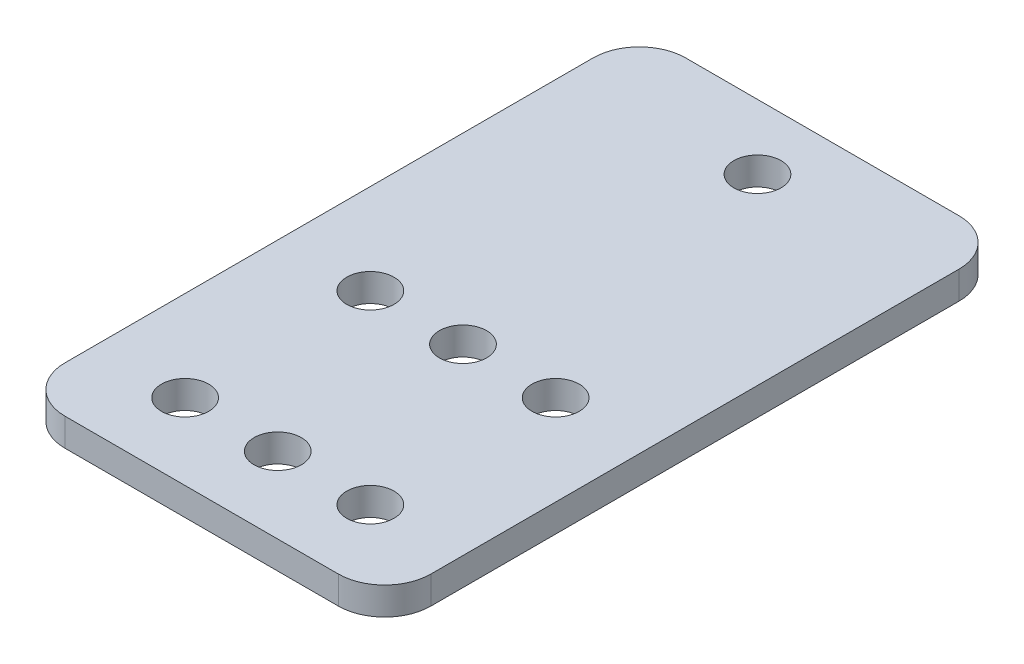
ISO-10303-21;
HEADER;
FILE_DESCRIPTION(('STEP AP214'),'2;1');
FILE_NAME('part.step','',(''),(''),'','','');
FILE_SCHEMA(('AUTOMOTIVE_DESIGN { 1 0 10303 214 1 1 1 1 }'));
ENDSEC;
DATA;
#1=APPLICATION_CONTEXT('core data for automotive mechanical design processes');
#2=APPLICATION_PROTOCOL_DEFINITION('international standard','automotive_design',2000,#1);
#3=PRODUCT_CONTEXT('',#1,'mechanical');
#4=PRODUCT('Part','Part','',(#3));
#5=PRODUCT_RELATED_PRODUCT_CATEGORY('part','',(#4));
#6=PRODUCT_DEFINITION_FORMATION('','',#4);
#7=PRODUCT_DEFINITION_CONTEXT('part definition',#1,'design');
#8=PRODUCT_DEFINITION('design','',#6,#7);
#9=PRODUCT_DEFINITION_SHAPE('','',#8);
#10=(LENGTH_UNIT() NAMED_UNIT(*) SI_UNIT(.MILLI.,.METRE.));
#11=(NAMED_UNIT(*) PLANE_ANGLE_UNIT() SI_UNIT($,.RADIAN.));
#12=(NAMED_UNIT(*) SI_UNIT($,.STERADIAN.) SOLID_ANGLE_UNIT());
#13=UNCERTAINTY_MEASURE_WITH_UNIT(LENGTH_MEASURE(1.E-05),#10,'distance_accuracy_value','');
#14=(GEOMETRIC_REPRESENTATION_CONTEXT(3) GLOBAL_UNCERTAINTY_ASSIGNED_CONTEXT((#13)) GLOBAL_UNIT_ASSIGNED_CONTEXT((#10,
#11,#12)) REPRESENTATION_CONTEXT('',''));
#15=CARTESIAN_POINT('',(0.,0.,0.));
#16=DIRECTION('',(0.,0.,1.));
#17=DIRECTION('',(1.,0.,0.));
#18=AXIS2_PLACEMENT_3D('',#15,#16,#17);
#19=CARTESIAN_POINT('',(19.75,3.,33.5));
#20=DIRECTION('',(-1.,0.,0.));
#21=DIRECTION('',(0.,0.,1.));
#22=AXIS2_PLACEMENT_3D('',#19,#20,#21);
#23=PLANE('',#22);
#24=DIRECTION('',(0.,0.,-1.));
#25=VECTOR('',#24,1.);
#26=CARTESIAN_POINT('',(19.75,3.,33.5));
#27=LINE('',#26,#25);
#28=CARTESIAN_POINT('',(19.75,3.,28.5));
#29=VERTEX_POINT('',#28);
#30=CARTESIAN_POINT('',(19.75,3.,-28.5));
#31=VERTEX_POINT('',#30);
#32=EDGE_CURVE('E123',#29,#31,#27,.T.);
#33=ORIENTED_EDGE('',*,*,#32,.F.);
#34=DIRECTION('',(0.,-1.,0.));
#35=VECTOR('',#34,1.);
#36=CARTESIAN_POINT('',(19.75,3.,28.5));
#37=LINE('',#36,#35);
#38=CARTESIAN_POINT('',(19.75,0.,28.5));
#39=VERTEX_POINT('',#38);
#40=EDGE_CURVE('E149',#29,#39,#37,.T.);
#41=ORIENTED_EDGE('',*,*,#40,.T.);
#42=DIRECTION('',(0.,0.,-1.));
#43=VECTOR('',#42,1.);
#44=CARTESIAN_POINT('',(19.75,0.,33.5));
#45=LINE('',#44,#43);
#46=CARTESIAN_POINT('',(19.75,0.,-28.5));
#47=VERTEX_POINT('',#46);
#48=EDGE_CURVE('E157',#39,#47,#45,.T.);
#49=ORIENTED_EDGE('',*,*,#48,.T.);
#50=DIRECTION('',(0.,-1.,0.));
#51=VECTOR('',#50,1.);
#52=CARTESIAN_POINT('',(19.75,3.,-28.5));
#53=LINE('',#52,#51);
#54=EDGE_CURVE('E147',#47,#31,#53,.F.);
#55=ORIENTED_EDGE('',*,*,#54,.T.);
#56=EDGE_LOOP('',(#33,#41,#49,#55));
#57=FACE_BOUND('',#56,.T.);
#58=ADVANCED_FACE('F32',(#57),#23,.F.);
#59=CARTESIAN_POINT('',(-19.75,3.,-33.5));
#60=DIRECTION('',(0.,0.,1.));
#61=DIRECTION('',(1.,0.,0.));
#62=AXIS2_PLACEMENT_3D('',#59,#60,#61);
#63=PLANE('',#62);
#64=DIRECTION('',(-1.,0.,0.));
#65=VECTOR('',#64,1.);
#66=CARTESIAN_POINT('',(-19.75,0.,-33.5));
#67=LINE('',#66,#65);
#68=CARTESIAN_POINT('',(14.75,0.,-33.5));
#69=VERTEX_POINT('',#68);
#70=CARTESIAN_POINT('',(-14.75,0.,-33.5));
#71=VERTEX_POINT('',#70);
#72=EDGE_CURVE('E128',#69,#71,#67,.T.);
#73=ORIENTED_EDGE('',*,*,#72,.T.);
#74=DIRECTION('',(0.,-1.,0.));
#75=VECTOR('',#74,1.);
#76=CARTESIAN_POINT('',(-14.75,3.,-33.5));
#77=LINE('',#76,#75);
#78=CARTESIAN_POINT('',(-14.75,3.,-33.5));
#79=VERTEX_POINT('',#78);
#80=EDGE_CURVE('E11',#71,#79,#77,.F.);
#81=ORIENTED_EDGE('',*,*,#80,.T.);
#82=DIRECTION('',(-1.,0.,0.));
#83=VECTOR('',#82,1.);
#84=CARTESIAN_POINT('',(-19.75,3.,-33.5));
#85=LINE('',#84,#83);
#86=CARTESIAN_POINT('',(14.75,3.,-33.5));
#87=VERTEX_POINT('',#86);
#88=EDGE_CURVE('E126',#87,#79,#85,.T.);
#89=ORIENTED_EDGE('',*,*,#88,.F.);
#90=DIRECTION('',(0.,-1.,0.));
#91=VECTOR('',#90,1.);
#92=CARTESIAN_POINT('',(14.75,3.,-33.5));
#93=LINE('',#92,#91);
#94=EDGE_CURVE('E40',#87,#69,#93,.T.);
#95=ORIENTED_EDGE('',*,*,#94,.T.);
#96=EDGE_LOOP('',(#73,#81,#89,#95));
#97=FACE_BOUND('',#96,.T.);
#98=ADVANCED_FACE('F154',(#97),#63,.F.);
#99=CARTESIAN_POINT('',(-19.75,3.,33.5));
#100=DIRECTION('',(1.,0.,0.));
#101=DIRECTION('',(0.,0.,-1.));
#102=AXIS2_PLACEMENT_3D('',#99,#100,#101);
#103=PLANE('',#102);
#104=DIRECTION('',(0.,0.,1.));
#105=VECTOR('',#104,1.);
#106=CARTESIAN_POINT('',(-19.75,0.,33.5));
#107=LINE('',#106,#105);
#108=CARTESIAN_POINT('',(-19.75,0.,-28.5));
#109=VERTEX_POINT('',#108);
#110=CARTESIAN_POINT('',(-19.75,0.,28.5));
#111=VERTEX_POINT('',#110);
#112=EDGE_CURVE('E124',#109,#111,#107,.T.);
#113=ORIENTED_EDGE('',*,*,#112,.T.);
#114=DIRECTION('',(0.,-1.,0.));
#115=VECTOR('',#114,1.);
#116=CARTESIAN_POINT('',(-19.75,3.,28.5));
#117=LINE('',#116,#115);
#118=CARTESIAN_POINT('',(-19.75,3.,28.5));
#119=VERTEX_POINT('',#118);
#120=EDGE_CURVE('E102',#111,#119,#117,.F.);
#121=ORIENTED_EDGE('',*,*,#120,.T.);
#122=DIRECTION('',(0.,0.,1.));
#123=VECTOR('',#122,1.);
#124=CARTESIAN_POINT('',(-19.75,3.,33.5));
#125=LINE('',#124,#123);
#126=CARTESIAN_POINT('',(-19.75,3.,-28.5));
#127=VERTEX_POINT('',#126);
#128=EDGE_CURVE('E162',#127,#119,#125,.T.);
#129=ORIENTED_EDGE('',*,*,#128,.F.);
#130=DIRECTION('',(0.,-1.,0.));
#131=VECTOR('',#130,1.);
#132=CARTESIAN_POINT('',(-19.75,3.,-28.5));
#133=LINE('',#132,#131);
#134=EDGE_CURVE('E107',#127,#109,#133,.T.);
#135=ORIENTED_EDGE('',*,*,#134,.T.);
#136=EDGE_LOOP('',(#113,#121,#129,#135));
#137=FACE_BOUND('',#136,.T.);
#138=ADVANCED_FACE('F230',(#137),#103,.F.);
#139=CARTESIAN_POINT('',(-19.75,3.,33.5));
#140=DIRECTION('',(0.,0.,-1.));
#141=DIRECTION('',(-1.,0.,0.));
#142=AXIS2_PLACEMENT_3D('',#139,#140,#141);
#143=PLANE('',#142);
#144=DIRECTION('',(1.,0.,0.));
#145=VECTOR('',#144,1.);
#146=CARTESIAN_POINT('',(-19.75,3.,33.5));
#147=LINE('',#146,#145);
#148=CARTESIAN_POINT('',(-14.75,3.,33.5));
#149=VERTEX_POINT('',#148);
#150=CARTESIAN_POINT('',(14.75,3.,33.5));
#151=VERTEX_POINT('',#150);
#152=EDGE_CURVE('E117',#149,#151,#147,.T.);
#153=ORIENTED_EDGE('',*,*,#152,.F.);
#154=DIRECTION('',(0.,-1.,0.));
#155=VECTOR('',#154,1.);
#156=CARTESIAN_POINT('',(-14.75,3.,33.5));
#157=LINE('',#156,#155);
#158=CARTESIAN_POINT('',(-14.75,0.,33.5));
#159=VERTEX_POINT('',#158);
#160=EDGE_CURVE('E101',#149,#159,#157,.T.);
#161=ORIENTED_EDGE('',*,*,#160,.T.);
#162=DIRECTION('',(1.,0.,0.));
#163=VECTOR('',#162,1.);
#164=CARTESIAN_POINT('',(-19.75,0.,33.5));
#165=LINE('',#164,#163);
#166=CARTESIAN_POINT('',(14.75,0.,33.5));
#167=VERTEX_POINT('',#166);
#168=EDGE_CURVE('E114',#159,#167,#165,.T.);
#169=ORIENTED_EDGE('',*,*,#168,.T.);
#170=DIRECTION('',(0.,-1.,0.));
#171=VECTOR('',#170,1.);
#172=CARTESIAN_POINT('',(14.75,3.,33.5));
#173=LINE('',#172,#171);
#174=EDGE_CURVE('E119',#167,#151,#173,.F.);
#175=ORIENTED_EDGE('',*,*,#174,.T.);
#176=EDGE_LOOP('',(#153,#161,#169,#175));
#177=FACE_BOUND('',#176,.T.);
#178=ADVANCED_FACE('F113',(#177),#143,.F.);
#179=CARTESIAN_POINT('',(0.,3.,0.));
#180=DIRECTION('',(0.,-1.,0.));
#181=DIRECTION('',(0.,0.,-1.));
#182=AXIS2_PLACEMENT_3D('',#179,#180,#181);
#183=PLANE('',#182);
#184=CARTESIAN_POINT('',(10.,3.,5.29));
#185=DIRECTION('',(0.,1.,0.));
#186=DIRECTION('',(0.,0.,-1.));
#187=AXIS2_PLACEMENT_3D('',#184,#185,#186);
#188=CIRCLE('',#187,2.55);
#189=CARTESIAN_POINT('',(10.,3.,2.74));
#190=VERTEX_POINT('',#189);
#191=EDGE_CURVE('E172',#190,#190,#188,.T.);
#192=ORIENTED_EDGE('',*,*,#191,.F.);
#193=EDGE_LOOP('',(#192));
#194=FACE_BOUND('',#193,.T.);
#195=CARTESIAN_POINT('',(10.,3.,25.29));
#196=DIRECTION('',(0.,1.,0.));
#197=DIRECTION('',(0.,0.,-1.));
#198=AXIS2_PLACEMENT_3D('',#195,#196,#197);
#199=CIRCLE('',#198,2.55);
#200=CARTESIAN_POINT('',(10.,3.,22.74));
#201=VERTEX_POINT('',#200);
#202=EDGE_CURVE('E178',#201,#201,#199,.T.);
#203=ORIENTED_EDGE('',*,*,#202,.F.);
#204=EDGE_LOOP('',(#203));
#205=FACE_BOUND('',#204,.T.);
#206=CARTESIAN_POINT('',(0.,3.,25.29));
#207=DIRECTION('',(0.,1.,0.));
#208=DIRECTION('',(0.,0.,1.));
#209=AXIS2_PLACEMENT_3D('',#206,#207,#208);
#210=CIRCLE('',#209,2.55);
#211=CARTESIAN_POINT('',(0.,3.,27.84));
#212=VERTEX_POINT('',#211);
#213=EDGE_CURVE('E192',#212,#212,#210,.T.);
#214=ORIENTED_EDGE('',*,*,#213,.F.);
#215=EDGE_LOOP('',(#214));
#216=FACE_BOUND('',#215,.T.);
#217=CARTESIAN_POINT('',(-10.,3.,5.29));
#218=DIRECTION('',(0.,1.,0.));
#219=DIRECTION('',(0.,0.,1.));
#220=AXIS2_PLACEMENT_3D('',#217,#218,#219);
#221=CIRCLE('',#220,2.55);
#222=CARTESIAN_POINT('',(-10.,3.,7.84));
#223=VERTEX_POINT('',#222);
#224=EDGE_CURVE('E185',#223,#223,#221,.T.);
#225=ORIENTED_EDGE('',*,*,#224,.F.);
#226=EDGE_LOOP('',(#225));
#227=FACE_BOUND('',#226,.T.);
#228=CARTESIAN_POINT('',(-10.,3.,25.29));
#229=DIRECTION('',(0.,1.,0.));
#230=DIRECTION('',(0.,0.,1.));
#231=AXIS2_PLACEMENT_3D('',#228,#229,#230);
#232=CIRCLE('',#231,2.55);
#233=CARTESIAN_POINT('',(-10.,3.,27.84));
#234=VERTEX_POINT('',#233);
#235=EDGE_CURVE('E202',#234,#234,#232,.T.);
#236=ORIENTED_EDGE('',*,*,#235,.F.);
#237=EDGE_LOOP('',(#236));
#238=FACE_BOUND('',#237,.T.);
#239=CARTESIAN_POINT('',(0.,3.,-26.5));
#240=DIRECTION('',(0.,1.,0.));
#241=DIRECTION('',(0.,0.,1.));
#242=AXIS2_PLACEMENT_3D('',#239,#240,#241);
#243=CIRCLE('',#242,2.55);
#244=CARTESIAN_POINT('',(0.,3.,-23.95));
#245=VERTEX_POINT('',#244);
#246=EDGE_CURVE('E184',#245,#245,#243,.T.);
#247=ORIENTED_EDGE('',*,*,#246,.F.);
#248=EDGE_LOOP('',(#247));
#249=FACE_BOUND('',#248,.T.);
#250=CARTESIAN_POINT('',(0.,3.,5.29));
#251=DIRECTION('',(0.,1.,0.));
#252=DIRECTION('',(0.,0.,1.));
#253=AXIS2_PLACEMENT_3D('',#250,#251,#252);
#254=CIRCLE('',#253,2.55);
#255=CARTESIAN_POINT('',(0.,3.,7.84));
#256=VERTEX_POINT('',#255);
#257=EDGE_CURVE('E166',#256,#256,#254,.T.);
#258=ORIENTED_EDGE('',*,*,#257,.F.);
#259=EDGE_LOOP('',(#258));
#260=FACE_BOUND('',#259,.T.);
#261=ORIENTED_EDGE('',*,*,#128,.T.);
#262=CARTESIAN_POINT('',(-14.75,3.,28.5));
#263=DIRECTION('',(0.,-1.,0.));
#264=DIRECTION('',(0.,0.,-1.));
#265=AXIS2_PLACEMENT_3D('',#262,#263,#264);
#266=CIRCLE('',#265,5.);
#267=EDGE_CURVE('E145',#119,#149,#266,.F.);
#268=ORIENTED_EDGE('',*,*,#267,.T.);
#269=ORIENTED_EDGE('',*,*,#152,.T.);
#270=CARTESIAN_POINT('',(14.75,3.,28.5));
#271=DIRECTION('',(0.,-1.,0.));
#272=DIRECTION('',(0.,0.,-1.));
#273=AXIS2_PLACEMENT_3D('',#270,#271,#272);
#274=CIRCLE('',#273,5.);
#275=EDGE_CURVE('E143',#151,#29,#274,.F.);
#276=ORIENTED_EDGE('',*,*,#275,.T.);
#277=ORIENTED_EDGE('',*,*,#32,.T.);
#278=CARTESIAN_POINT('',(14.75,3.,-28.5));
#279=DIRECTION('',(0.,-1.,0.));
#280=DIRECTION('',(0.,0.,-1.));
#281=AXIS2_PLACEMENT_3D('',#278,#279,#280);
#282=CIRCLE('',#281,5.);
#283=EDGE_CURVE('E52',#31,#87,#282,.F.);
#284=ORIENTED_EDGE('',*,*,#283,.T.);
#285=ORIENTED_EDGE('',*,*,#88,.T.);
#286=CARTESIAN_POINT('',(-14.75,3.,-28.5));
#287=DIRECTION('',(0.,-1.,0.));
#288=DIRECTION('',(0.,0.,-1.));
#289=AXIS2_PLACEMENT_3D('',#286,#287,#288);
#290=CIRCLE('',#289,5.);
#291=EDGE_CURVE('E141',#79,#127,#290,.F.);
#292=ORIENTED_EDGE('',*,*,#291,.T.);
#293=EDGE_LOOP('',(#261,#268,#269,#276,#277,#284,#285,#292));
#294=FACE_BOUND('',#293,.T.);
#295=ADVANCED_FACE('F218',(#194,#205,#216,#227,#238,#249,#260,#294),#183,.F.);
#296=CARTESIAN_POINT('',(0.,0.,0.));
#297=DIRECTION('',(0.,-1.,0.));
#298=DIRECTION('',(0.,0.,-1.));
#299=AXIS2_PLACEMENT_3D('',#296,#297,#298);
#300=PLANE('',#299);
#301=CARTESIAN_POINT('',(10.,0.,5.29));
#302=DIRECTION('',(0.,1.,0.));
#303=DIRECTION('',(0.,0.,-1.));
#304=AXIS2_PLACEMENT_3D('',#301,#302,#303);
#305=CIRCLE('',#304,2.55);
#306=CARTESIAN_POINT('',(10.,0.,2.74));
#307=VERTEX_POINT('',#306);
#308=EDGE_CURVE('E175',#307,#307,#305,.T.);
#309=ORIENTED_EDGE('',*,*,#308,.T.);
#310=EDGE_LOOP('',(#309));
#311=FACE_BOUND('',#310,.T.);
#312=CARTESIAN_POINT('',(10.,0.,25.29));
#313=DIRECTION('',(0.,1.,0.));
#314=DIRECTION('',(0.,0.,-1.));
#315=AXIS2_PLACEMENT_3D('',#312,#313,#314);
#316=CIRCLE('',#315,2.55);
#317=CARTESIAN_POINT('',(10.,0.,22.74));
#318=VERTEX_POINT('',#317);
#319=EDGE_CURVE('E181',#318,#318,#316,.T.);
#320=ORIENTED_EDGE('',*,*,#319,.T.);
#321=EDGE_LOOP('',(#320));
#322=FACE_BOUND('',#321,.T.);
#323=CARTESIAN_POINT('',(0.,0.,25.29));
#324=DIRECTION('',(0.,1.,0.));
#325=DIRECTION('',(0.,0.,1.));
#326=AXIS2_PLACEMENT_3D('',#323,#324,#325);
#327=CIRCLE('',#326,2.55);
#328=CARTESIAN_POINT('',(0.,0.,27.84));
#329=VERTEX_POINT('',#328);
#330=EDGE_CURVE('E169',#329,#329,#327,.T.);
#331=ORIENTED_EDGE('',*,*,#330,.T.);
#332=EDGE_LOOP('',(#331));
#333=FACE_BOUND('',#332,.T.);
#334=CARTESIAN_POINT('',(-10.,0.,5.29));
#335=DIRECTION('',(0.,1.,0.));
#336=DIRECTION('',(0.,0.,1.));
#337=AXIS2_PLACEMENT_3D('',#334,#335,#336);
#338=CIRCLE('',#337,2.55);
#339=CARTESIAN_POINT('',(-10.,0.,7.84));
#340=VERTEX_POINT('',#339);
#341=EDGE_CURVE('E188',#340,#340,#338,.T.);
#342=ORIENTED_EDGE('',*,*,#341,.T.);
#343=EDGE_LOOP('',(#342));
#344=FACE_BOUND('',#343,.T.);
#345=CARTESIAN_POINT('',(-10.,0.,25.29));
#346=DIRECTION('',(0.,1.,0.));
#347=DIRECTION('',(0.,0.,1.));
#348=AXIS2_PLACEMENT_3D('',#345,#346,#347);
#349=CIRCLE('',#348,2.55);
#350=CARTESIAN_POINT('',(-10.,0.,27.84));
#351=VERTEX_POINT('',#350);
#352=EDGE_CURVE('E189',#351,#351,#349,.T.);
#353=ORIENTED_EDGE('',*,*,#352,.T.);
#354=EDGE_LOOP('',(#353));
#355=FACE_BOUND('',#354,.T.);
#356=CARTESIAN_POINT('',(0.,0.,-26.5));
#357=DIRECTION('',(0.,1.,0.));
#358=DIRECTION('',(0.,0.,1.));
#359=AXIS2_PLACEMENT_3D('',#356,#357,#358);
#360=CIRCLE('',#359,2.55);
#361=CARTESIAN_POINT('',(0.,0.,-23.95));
#362=VERTEX_POINT('',#361);
#363=EDGE_CURVE('E199',#362,#362,#360,.T.);
#364=ORIENTED_EDGE('',*,*,#363,.T.);
#365=EDGE_LOOP('',(#364));
#366=FACE_BOUND('',#365,.T.);
#367=CARTESIAN_POINT('',(0.,0.,5.29));
#368=DIRECTION('',(0.,1.,0.));
#369=DIRECTION('',(0.,0.,1.));
#370=AXIS2_PLACEMENT_3D('',#367,#368,#369);
#371=CIRCLE('',#370,2.55);
#372=CARTESIAN_POINT('',(0.,0.,7.84));
#373=VERTEX_POINT('',#372);
#374=EDGE_CURVE('E158',#373,#373,#371,.T.);
#375=ORIENTED_EDGE('',*,*,#374,.T.);
#376=EDGE_LOOP('',(#375));
#377=FACE_BOUND('',#376,.T.);
#378=ORIENTED_EDGE('',*,*,#168,.F.);
#379=CARTESIAN_POINT('',(-14.75,0.,28.5));
#380=DIRECTION('',(0.,-1.,0.));
#381=DIRECTION('',(0.,0.,-1.));
#382=AXIS2_PLACEMENT_3D('',#379,#380,#381);
#383=CIRCLE('',#382,5.);
#384=EDGE_CURVE('E97',#159,#111,#383,.T.);
#385=ORIENTED_EDGE('',*,*,#384,.T.);
#386=ORIENTED_EDGE('',*,*,#112,.F.);
#387=CARTESIAN_POINT('',(-14.75,0.,-28.5));
#388=DIRECTION('',(0.,-1.,0.));
#389=DIRECTION('',(0.,0.,-1.));
#390=AXIS2_PLACEMENT_3D('',#387,#388,#389);
#391=CIRCLE('',#390,5.);
#392=EDGE_CURVE('E134',#109,#71,#391,.T.);
#393=ORIENTED_EDGE('',*,*,#392,.T.);
#394=ORIENTED_EDGE('',*,*,#72,.F.);
#395=CARTESIAN_POINT('',(14.75,0.,-28.5));
#396=DIRECTION('',(0.,-1.,0.));
#397=DIRECTION('',(0.,0.,-1.));
#398=AXIS2_PLACEMENT_3D('',#395,#396,#397);
#399=CIRCLE('',#398,5.);
#400=EDGE_CURVE('E118',#69,#47,#399,.T.);
#401=ORIENTED_EDGE('',*,*,#400,.T.);
#402=ORIENTED_EDGE('',*,*,#48,.F.);
#403=CARTESIAN_POINT('',(14.75,0.,28.5));
#404=DIRECTION('',(0.,-1.,0.));
#405=DIRECTION('',(0.,0.,-1.));
#406=AXIS2_PLACEMENT_3D('',#403,#404,#405);
#407=CIRCLE('',#406,5.);
#408=EDGE_CURVE('E108',#39,#167,#407,.T.);
#409=ORIENTED_EDGE('',*,*,#408,.T.);
#410=EDGE_LOOP('',(#378,#385,#386,#393,#394,#401,#402,#409));
#411=FACE_BOUND('',#410,.T.);
#412=ADVANCED_FACE('F121',(#311,#322,#333,#344,#355,#366,#377,#411),#300,.T.);
#413=CARTESIAN_POINT('',(0.,0.,5.29));
#414=DIRECTION('',(0.,1.,0.));
#415=DIRECTION('',(0.,0.,1.));
#416=AXIS2_PLACEMENT_3D('',#413,#414,#415);
#417=CYLINDRICAL_SURFACE('',#416,2.55);
#418=ORIENTED_EDGE('',*,*,#374,.F.);
#419=EDGE_LOOP('',(#418));
#420=FACE_BOUND('',#419,.T.);
#421=ORIENTED_EDGE('',*,*,#257,.T.);
#422=EDGE_LOOP('',(#421));
#423=FACE_BOUND('',#422,.T.);
#424=ADVANCED_FACE('F269',(#420,#423),#417,.F.);
#425=CARTESIAN_POINT('',(0.,0.,-26.5));
#426=DIRECTION('',(0.,1.,0.));
#427=DIRECTION('',(0.,0.,1.));
#428=AXIS2_PLACEMENT_3D('',#425,#426,#427);
#429=CYLINDRICAL_SURFACE('',#428,2.55);
#430=ORIENTED_EDGE('',*,*,#363,.F.);
#431=EDGE_LOOP('',(#430));
#432=FACE_BOUND('',#431,.T.);
#433=ORIENTED_EDGE('',*,*,#246,.T.);
#434=EDGE_LOOP('',(#433));
#435=FACE_BOUND('',#434,.T.);
#436=ADVANCED_FACE('F214',(#432,#435),#429,.F.);
#437=CARTESIAN_POINT('',(-10.,0.,25.29));
#438=DIRECTION('',(0.,1.,0.));
#439=DIRECTION('',(0.,0.,1.));
#440=AXIS2_PLACEMENT_3D('',#437,#438,#439);
#441=CYLINDRICAL_SURFACE('',#440,2.55);
#442=ORIENTED_EDGE('',*,*,#352,.F.);
#443=EDGE_LOOP('',(#442));
#444=FACE_BOUND('',#443,.T.);
#445=ORIENTED_EDGE('',*,*,#235,.T.);
#446=EDGE_LOOP('',(#445));
#447=FACE_BOUND('',#446,.T.);
#448=ADVANCED_FACE('F210',(#444,#447),#441,.F.);
#449=CARTESIAN_POINT('',(-10.,0.,5.29));
#450=DIRECTION('',(0.,1.,0.));
#451=DIRECTION('',(0.,0.,1.));
#452=AXIS2_PLACEMENT_3D('',#449,#450,#451);
#453=CYLINDRICAL_SURFACE('',#452,2.55);
#454=ORIENTED_EDGE('',*,*,#341,.F.);
#455=EDGE_LOOP('',(#454));
#456=FACE_BOUND('',#455,.T.);
#457=ORIENTED_EDGE('',*,*,#224,.T.);
#458=EDGE_LOOP('',(#457));
#459=FACE_BOUND('',#458,.T.);
#460=ADVANCED_FACE('F213',(#456,#459),#453,.F.);
#461=CARTESIAN_POINT('',(0.,0.,25.29));
#462=DIRECTION('',(0.,1.,0.));
#463=DIRECTION('',(0.,0.,1.));
#464=AXIS2_PLACEMENT_3D('',#461,#462,#463);
#465=CYLINDRICAL_SURFACE('',#464,2.55);
#466=ORIENTED_EDGE('',*,*,#330,.F.);
#467=EDGE_LOOP('',(#466));
#468=FACE_BOUND('',#467,.T.);
#469=ORIENTED_EDGE('',*,*,#213,.T.);
#470=EDGE_LOOP('',(#469));
#471=FACE_BOUND('',#470,.T.);
#472=ADVANCED_FACE('F262',(#468,#471),#465,.F.);
#473=CARTESIAN_POINT('',(10.,0.,25.29));
#474=DIRECTION('',(0.,1.,0.));
#475=DIRECTION('',(0.,0.,1.));
#476=AXIS2_PLACEMENT_3D('',#473,#474,#475);
#477=CYLINDRICAL_SURFACE('',#476,2.55);
#478=ORIENTED_EDGE('',*,*,#319,.F.);
#479=EDGE_LOOP('',(#478));
#480=FACE_BOUND('',#479,.T.);
#481=ORIENTED_EDGE('',*,*,#202,.T.);
#482=EDGE_LOOP('',(#481));
#483=FACE_BOUND('',#482,.T.);
#484=ADVANCED_FACE('F256',(#480,#483),#477,.F.);
#485=CARTESIAN_POINT('',(10.,0.,5.29));
#486=DIRECTION('',(0.,1.,0.));
#487=DIRECTION('',(0.,0.,1.));
#488=AXIS2_PLACEMENT_3D('',#485,#486,#487);
#489=CYLINDRICAL_SURFACE('',#488,2.55);
#490=ORIENTED_EDGE('',*,*,#308,.F.);
#491=EDGE_LOOP('',(#490));
#492=FACE_BOUND('',#491,.T.);
#493=ORIENTED_EDGE('',*,*,#191,.T.);
#494=EDGE_LOOP('',(#493));
#495=FACE_BOUND('',#494,.T.);
#496=ADVANCED_FACE('F252',(#492,#495),#489,.F.);
#497=CARTESIAN_POINT('',(-14.75,3.,28.5));
#498=DIRECTION('',(0.,-1.,0.));
#499=DIRECTION('',(0.,0.,-1.));
#500=AXIS2_PLACEMENT_3D('',#497,#498,#499);
#501=CYLINDRICAL_SURFACE('',#500,5.);
#502=ORIENTED_EDGE('',*,*,#267,.F.);
#503=ORIENTED_EDGE('',*,*,#120,.F.);
#504=ORIENTED_EDGE('',*,*,#384,.F.);
#505=ORIENTED_EDGE('',*,*,#160,.F.);
#506=EDGE_LOOP('',(#502,#503,#504,#505));
#507=FACE_BOUND('',#506,.T.);
#508=ADVANCED_FACE('F100',(#507),#501,.T.);
#509=CARTESIAN_POINT('',(14.75,3.,28.5));
#510=DIRECTION('',(0.,-1.,0.));
#511=DIRECTION('',(0.,0.,-1.));
#512=AXIS2_PLACEMENT_3D('',#509,#510,#511);
#513=CYLINDRICAL_SURFACE('',#512,5.);
#514=ORIENTED_EDGE('',*,*,#275,.F.);
#515=ORIENTED_EDGE('',*,*,#174,.F.);
#516=ORIENTED_EDGE('',*,*,#408,.F.);
#517=ORIENTED_EDGE('',*,*,#40,.F.);
#518=EDGE_LOOP('',(#514,#515,#516,#517));
#519=FACE_BOUND('',#518,.T.);
#520=ADVANCED_FACE('F234',(#519),#513,.T.);
#521=CARTESIAN_POINT('',(-14.75,3.,-28.5));
#522=DIRECTION('',(0.,-1.,0.));
#523=DIRECTION('',(0.,0.,-1.));
#524=AXIS2_PLACEMENT_3D('',#521,#522,#523);
#525=CYLINDRICAL_SURFACE('',#524,5.);
#526=ORIENTED_EDGE('',*,*,#291,.F.);
#527=ORIENTED_EDGE('',*,*,#80,.F.);
#528=ORIENTED_EDGE('',*,*,#392,.F.);
#529=ORIENTED_EDGE('',*,*,#134,.F.);
#530=EDGE_LOOP('',(#526,#527,#528,#529));
#531=FACE_BOUND('',#530,.T.);
#532=ADVANCED_FACE('F232',(#531),#525,.T.);
#533=CARTESIAN_POINT('',(14.75,3.,-28.5));
#534=DIRECTION('',(0.,-1.,0.));
#535=DIRECTION('',(0.,0.,-1.));
#536=AXIS2_PLACEMENT_3D('',#533,#534,#535);
#537=CYLINDRICAL_SURFACE('',#536,5.);
#538=ORIENTED_EDGE('',*,*,#283,.F.);
#539=ORIENTED_EDGE('',*,*,#54,.F.);
#540=ORIENTED_EDGE('',*,*,#400,.F.);
#541=ORIENTED_EDGE('',*,*,#94,.F.);
#542=EDGE_LOOP('',(#538,#539,#540,#541));
#543=FACE_BOUND('',#542,.T.);
#544=ADVANCED_FACE('F34',(#543),#537,.T.);
#545=CLOSED_SHELL('',(#58,#98,#138,#178,#295,#412,#424,#436,#448,#460,#472,#484,#496,#508,#520,
#532,#544));
#546=MANIFOLD_SOLID_BREP('B2',#545);
#547=ADVANCED_BREP_SHAPE_REPRESENTATION('',(#18,#546),#14);
#548=SHAPE_DEFINITION_REPRESENTATION(#9,#547);
ENDSEC;
END-ISO-10303-21;
